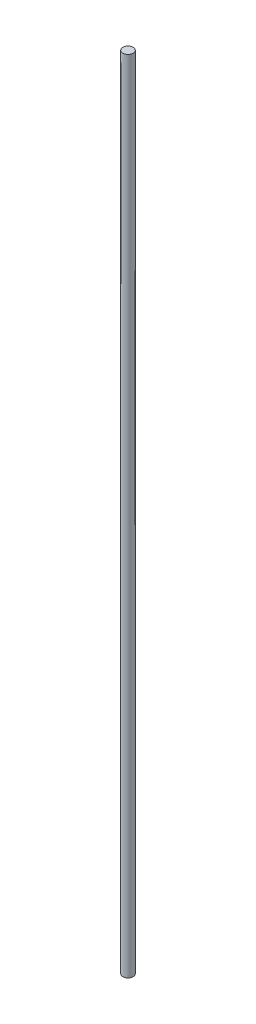
ISO-10303-21;
HEADER;
FILE_DESCRIPTION(('STEP AP214'),'2;1');
FILE_NAME('part.step','',(''),(''),'','','');
FILE_SCHEMA(('AUTOMOTIVE_DESIGN { 1 0 10303 214 1 1 1 1 }'));
ENDSEC;
DATA;
#1=APPLICATION_CONTEXT('core data for automotive mechanical design processes');
#2=APPLICATION_PROTOCOL_DEFINITION('international standard','automotive_design',2000,#1);
#3=PRODUCT_CONTEXT('',#1,'mechanical');
#4=PRODUCT('Part','Part','',(#3));
#5=PRODUCT_RELATED_PRODUCT_CATEGORY('part','',(#4));
#6=PRODUCT_DEFINITION_FORMATION('','',#4);
#7=PRODUCT_DEFINITION_CONTEXT('part definition',#1,'design');
#8=PRODUCT_DEFINITION('design','',#6,#7);
#9=PRODUCT_DEFINITION_SHAPE('','',#8);
#10=(LENGTH_UNIT() NAMED_UNIT(*) SI_UNIT(.MILLI.,.METRE.));
#11=(NAMED_UNIT(*) PLANE_ANGLE_UNIT() SI_UNIT($,.RADIAN.));
#12=(NAMED_UNIT(*) SI_UNIT($,.STERADIAN.) SOLID_ANGLE_UNIT());
#13=UNCERTAINTY_MEASURE_WITH_UNIT(LENGTH_MEASURE(1.E-05),#10,'distance_accuracy_value','');
#14=(GEOMETRIC_REPRESENTATION_CONTEXT(3) GLOBAL_UNCERTAINTY_ASSIGNED_CONTEXT((#13)) GLOBAL_UNIT_ASSIGNED_CONTEXT((#10,
#11,#12)) REPRESENTATION_CONTEXT('',''));
#15=CARTESIAN_POINT('',(0.,0.,0.));
#16=DIRECTION('',(0.,0.,1.));
#17=DIRECTION('',(1.,0.,0.));
#18=AXIS2_PLACEMENT_3D('',#15,#16,#17);
#19=CARTESIAN_POINT('',(0.,186.,0.));
#20=DIRECTION('',(0.,-1.,0.));
#21=DIRECTION('',(0.,0.,-1.));
#22=AXIS2_PLACEMENT_3D('',#19,#20,#21);
#23=CYLINDRICAL_SURFACE('',#22,1.2);
#24=CARTESIAN_POINT('',(0.,186.,0.));
#25=DIRECTION('',(0.,1.,0.));
#26=DIRECTION('',(0.,0.,1.));
#27=AXIS2_PLACEMENT_3D('',#24,#25,#26);
#28=CIRCLE('',#27,1.2);
#29=CARTESIAN_POINT('',(0.,186.,-1.2));
#30=VERTEX_POINT('',#29);
#31=EDGE_CURVE('E10',#30,#30,#28,.T.);
#32=CARTESIAN_POINT('',(0.,0.,0.));
#33=DIRECTION('',(0.,1.,0.));
#34=DIRECTION('',(0.,0.,1.));
#35=AXIS2_PLACEMENT_3D('',#32,#33,#34);
#36=CIRCLE('',#35,1.2);
#37=CARTESIAN_POINT('',(0.,0.,-1.2));
#38=VERTEX_POINT('',#37);
#39=EDGE_CURVE('E37',#38,#38,#36,.T.);
#40=CARTESIAN_POINT('',(0.,186.,-1.2));
#41=CARTESIAN_POINT('',(0.,184.0625,-1.2));
#42=CARTESIAN_POINT('',(0.,182.125,-1.2));
#43=CARTESIAN_POINT('',(0.,178.25,-1.2));
#44=CARTESIAN_POINT('',(0.,176.3125,-1.2));
#45=CARTESIAN_POINT('',(0.,172.4375,-1.2));
#46=CARTESIAN_POINT('',(0.,170.5,-1.2));
#47=CARTESIAN_POINT('',(0.,166.625,-1.2));
#48=CARTESIAN_POINT('',(0.,164.6875,-1.2));
#49=CARTESIAN_POINT('',(0.,160.8125,-1.2));
#50=CARTESIAN_POINT('',(0.,158.875,-1.2));
#51=CARTESIAN_POINT('',(0.,155.,-1.2));
#52=CARTESIAN_POINT('',(0.,153.0625,-1.2));
#53=CARTESIAN_POINT('',(0.,149.1875,-1.2));
#54=CARTESIAN_POINT('',(0.,147.25,-1.2));
#55=CARTESIAN_POINT('',(0.,143.375,-1.2));
#56=CARTESIAN_POINT('',(0.,141.4375,-1.2));
#57=CARTESIAN_POINT('',(0.,137.5625,-1.2));
#58=CARTESIAN_POINT('',(0.,135.625,-1.2));
#59=CARTESIAN_POINT('',(0.,131.75,-1.2));
#60=CARTESIAN_POINT('',(0.,129.8125,-1.2));
#61=CARTESIAN_POINT('',(0.,125.9375,-1.2));
#62=CARTESIAN_POINT('',(0.,124.,-1.2));
#63=CARTESIAN_POINT('',(0.,120.125,-1.2));
#64=CARTESIAN_POINT('',(0.,118.1875,-1.2));
#65=CARTESIAN_POINT('',(0.,114.3125,-1.2));
#66=CARTESIAN_POINT('',(0.,112.375,-1.2));
#67=CARTESIAN_POINT('',(0.,108.5,-1.2));
#68=CARTESIAN_POINT('',(0.,106.5625,-1.2));
#69=CARTESIAN_POINT('',(0.,102.6875,-1.2));
#70=CARTESIAN_POINT('',(0.,100.75,-1.2));
#71=CARTESIAN_POINT('',(0.,96.875,-1.2));
#72=CARTESIAN_POINT('',(0.,94.9375,-1.2));
#73=CARTESIAN_POINT('',(0.,91.0625,-1.2));
#74=CARTESIAN_POINT('',(0.,89.125,-1.2));
#75=CARTESIAN_POINT('',(0.,85.25,-1.2));
#76=CARTESIAN_POINT('',(0.,83.3125,-1.2));
#77=CARTESIAN_POINT('',(0.,79.4375,-1.2));
#78=CARTESIAN_POINT('',(0.,77.5,-1.2));
#79=CARTESIAN_POINT('',(0.,73.625,-1.2));
#80=CARTESIAN_POINT('',(0.,71.6875,-1.2));
#81=CARTESIAN_POINT('',(0.,67.8125,-1.2));
#82=CARTESIAN_POINT('',(0.,65.875,-1.2));
#83=CARTESIAN_POINT('',(0.,62.,-1.2));
#84=CARTESIAN_POINT('',(0.,60.0625,-1.2));
#85=CARTESIAN_POINT('',(0.,56.1875,-1.2));
#86=CARTESIAN_POINT('',(0.,54.25,-1.2));
#87=CARTESIAN_POINT('',(0.,50.375,-1.2));
#88=CARTESIAN_POINT('',(0.,48.4375,-1.2));
#89=CARTESIAN_POINT('',(0.,44.5625,-1.2));
#90=CARTESIAN_POINT('',(0.,42.625,-1.2));
#91=CARTESIAN_POINT('',(0.,38.75,-1.2));
#92=CARTESIAN_POINT('',(0.,36.8125,-1.2));
#93=CARTESIAN_POINT('',(0.,32.9375,-1.2));
#94=CARTESIAN_POINT('',(0.,31.,-1.2));
#95=CARTESIAN_POINT('',(0.,27.125,-1.2));
#96=CARTESIAN_POINT('',(0.,25.1875,-1.2));
#97=CARTESIAN_POINT('',(0.,21.3125,-1.2));
#98=CARTESIAN_POINT('',(0.,19.375,-1.2));
#99=CARTESIAN_POINT('',(0.,15.5,-1.2));
#100=CARTESIAN_POINT('',(0.,13.5625,-1.2));
#101=CARTESIAN_POINT('',(0.,9.68749999999997,-1.2));
#102=CARTESIAN_POINT('',(0.,7.74999999999997,-1.2));
#103=CARTESIAN_POINT('',(0.,3.87499999999997,-1.2));
#104=CARTESIAN_POINT('',(0.,1.93749999999997,-1.2));
#105=CARTESIAN_POINT('',(0.,0.,-1.2));
#106=B_SPLINE_CURVE_WITH_KNOTS('',3,(#40,#41,#42,#43,#44,#45,#46,#47,#48,#49,#50,#51,#52,#53,
#54,#55,#56,#57,#58,#59,#60,#61,#62,#63,#64,#65,#66,#67,#68,#69,#70,#71,#72,#73,#74,#75,#76,#77,
#78,#79,#80,#81,#82,#83,#84,#85,#86,#87,#88,#89,#90,#91,#92,#93,#94,#95,#96,#97,#98,#99,#100,
#101,#102,#103,#104,#105),.UNSPECIFIED.,.F.,.F.,(4,2,2,2,2,2,2,2,2,2,2,2,2,2,2,2,2,2,2,2,2,2,2,
2,2,2,2,2,2,2,2,2,4),(0.,5.81250000000003,11.625,17.4375,23.25,29.0625,34.875,40.6875,46.5,
52.3125,58.125,63.9375,69.75,75.5625,81.375,87.1875,93.,98.8125,104.625,110.4375,116.25,
122.0625,127.875,133.6875,139.5,145.3125,151.125,156.9375,162.75,168.5625,174.375,180.1875,
186.),.UNSPECIFIED.);
#107=EDGE_CURVE('BSEAM34',#30,#38,#106,.T.);
#108=ORIENTED_EDGE('',*,*,#31,.F.);
#109=ORIENTED_EDGE('',*,*,#39,.T.);
#110=ORIENTED_EDGE('',*,*,#107,.T.);
#111=ORIENTED_EDGE('',*,*,#107,.F.);
#112=EDGE_LOOP('',(#108,#110,#109,#111));
#113=FACE_BOUND('',#112,.T.);
#114=ADVANCED_FACE('F34',(#113),#23,.T.);
#115=CARTESIAN_POINT('',(0.,186.,0.));
#116=DIRECTION('',(0.,1.,0.));
#117=DIRECTION('',(0.,0.,1.));
#118=AXIS2_PLACEMENT_3D('',#115,#116,#117);
#119=PLANE('',#118);
#120=ORIENTED_EDGE('',*,*,#31,.T.);
#121=EDGE_LOOP('',(#120));
#122=FACE_BOUND('',#121,.T.);
#123=ADVANCED_FACE('F49',(#122),#119,.T.);
#124=CARTESIAN_POINT('',(0.,0.,0.));
#125=DIRECTION('',(0.,1.,0.));
#126=DIRECTION('',(0.,0.,1.));
#127=AXIS2_PLACEMENT_3D('',#124,#125,#126);
#128=PLANE('',#127);
#129=ORIENTED_EDGE('',*,*,#39,.F.);
#130=EDGE_LOOP('',(#129));
#131=FACE_BOUND('',#130,.T.);
#132=ADVANCED_FACE('F47',(#131),#128,.F.);
#133=CLOSED_SHELL('',(#114,#123,#132));
#134=MANIFOLD_SOLID_BREP('B2',#133);
#135=ADVANCED_BREP_SHAPE_REPRESENTATION('',(#18,#134),#14);
#136=SHAPE_DEFINITION_REPRESENTATION(#9,#135);
ENDSEC;
END-ISO-10303-21;
